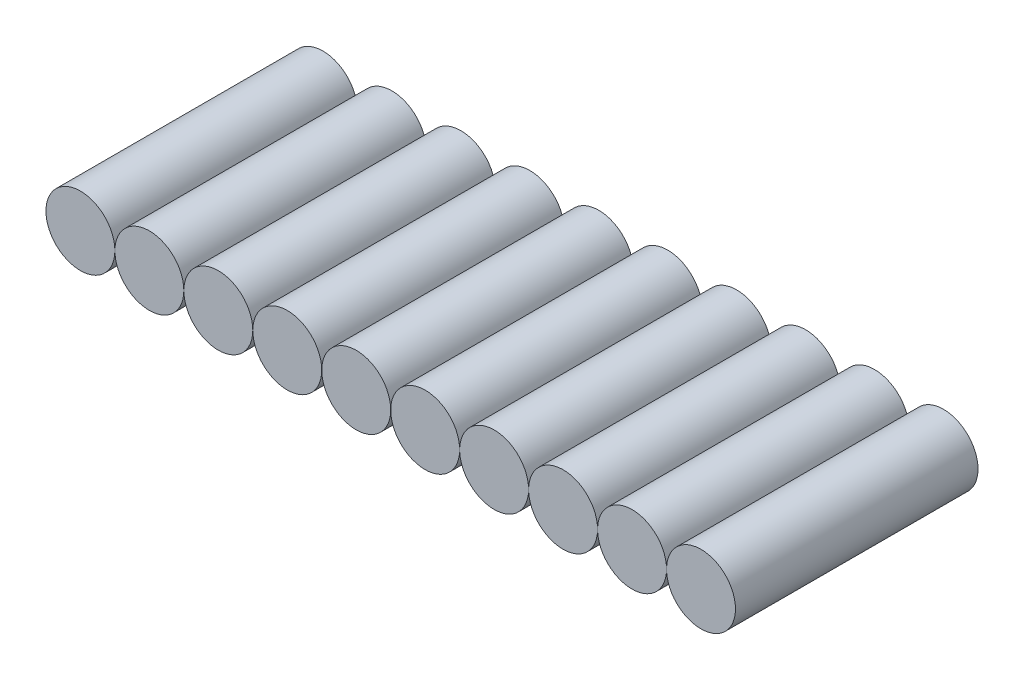
ISO-10303-21;
HEADER;
FILE_DESCRIPTION(('STEP AP214'),'2;1');
FILE_NAME('part.step','',(''),(''),'','','');
FILE_SCHEMA(('AUTOMOTIVE_DESIGN { 1 0 10303 214 1 1 1 1 }'));
ENDSEC;
DATA;
#1=APPLICATION_CONTEXT('core data for automotive mechanical design processes');
#2=APPLICATION_PROTOCOL_DEFINITION('international standard','automotive_design',2000,#1);
#3=PRODUCT_CONTEXT('',#1,'mechanical');
#4=PRODUCT('Part','Part','',(#3));
#5=PRODUCT_RELATED_PRODUCT_CATEGORY('part','',(#4));
#6=PRODUCT_DEFINITION_FORMATION('','',#4);
#7=PRODUCT_DEFINITION_CONTEXT('part definition',#1,'design');
#8=PRODUCT_DEFINITION('design','',#6,#7);
#9=PRODUCT_DEFINITION_SHAPE('','',#8);
#10=(LENGTH_UNIT() NAMED_UNIT(*) SI_UNIT(.MILLI.,.METRE.));
#11=(NAMED_UNIT(*) PLANE_ANGLE_UNIT() SI_UNIT($,.RADIAN.));
#12=(NAMED_UNIT(*) SI_UNIT($,.STERADIAN.) SOLID_ANGLE_UNIT());
#13=UNCERTAINTY_MEASURE_WITH_UNIT(LENGTH_MEASURE(1.E-05),#10,'distance_accuracy_value','');
#14=(GEOMETRIC_REPRESENTATION_CONTEXT(3) GLOBAL_UNCERTAINTY_ASSIGNED_CONTEXT((#13)) GLOBAL_UNIT_ASSIGNED_CONTEXT((#10,
#11,#12)) REPRESENTATION_CONTEXT('',''));
#15=CARTESIAN_POINT('',(0.,0.,0.));
#16=DIRECTION('',(0.,0.,1.));
#17=DIRECTION('',(1.,0.,0.));
#18=AXIS2_PLACEMENT_3D('',#15,#16,#17);
#19=CARTESIAN_POINT('',(130.5,0.,51.));
#20=DIRECTION('',(0.,0.,-1.));
#21=DIRECTION('',(-1.,0.,0.));
#22=AXIS2_PLACEMENT_3D('',#19,#20,#21);
#23=CYLINDRICAL_SURFACE('',#22,7.25);
#24=CARTESIAN_POINT('',(130.5,0.,51.));
#25=DIRECTION('',(0.,0.,1.));
#26=DIRECTION('',(1.,0.,0.));
#27=AXIS2_PLACEMENT_3D('',#24,#25,#26);
#28=CIRCLE('',#27,7.25);
#29=CARTESIAN_POINT('',(137.75,0.,51.));
#30=VERTEX_POINT('',#29);
#31=EDGE_CURVE('E12',#30,#30,#28,.T.);
#32=ORIENTED_EDGE('',*,*,#31,.F.);
#33=EDGE_LOOP('',(#32));
#34=FACE_BOUND('',#33,.T.);
#35=CARTESIAN_POINT('',(130.5,0.,0.));
#36=DIRECTION('',(0.,0.,1.));
#37=DIRECTION('',(1.,0.,0.));
#38=AXIS2_PLACEMENT_3D('',#35,#36,#37);
#39=CIRCLE('',#38,7.25);
#40=CARTESIAN_POINT('',(137.75,0.,0.));
#41=VERTEX_POINT('',#40);
#42=EDGE_CURVE('E99',#41,#41,#39,.T.);
#43=ORIENTED_EDGE('',*,*,#42,.T.);
#44=EDGE_LOOP('',(#43));
#45=FACE_BOUND('',#44,.T.);
#46=ADVANCED_FACE('F96',(#34,#45),#23,.T.);
#47=CARTESIAN_POINT('',(0.,0.,51.));
#48=DIRECTION('',(0.,0.,1.));
#49=DIRECTION('',(1.,0.,0.));
#50=AXIS2_PLACEMENT_3D('',#47,#48,#49);
#51=PLANE('',#50);
#52=ORIENTED_EDGE('',*,*,#31,.T.);
#53=EDGE_LOOP('',(#52));
#54=FACE_BOUND('',#53,.T.);
#55=ADVANCED_FACE('F111',(#54),#51,.T.);
#56=CARTESIAN_POINT('',(0.,0.,0.));
#57=DIRECTION('',(0.,0.,1.));
#58=DIRECTION('',(1.,0.,0.));
#59=AXIS2_PLACEMENT_3D('',#56,#57,#58);
#60=PLANE('',#59);
#61=ORIENTED_EDGE('',*,*,#42,.F.);
#62=EDGE_LOOP('',(#61));
#63=FACE_BOUND('',#62,.T.);
#64=ADVANCED_FACE('F109',(#63),#60,.F.);
#65=CLOSED_SHELL('',(#46,#55,#64));
#66=MANIFOLD_SOLID_BREP('B2',#65);
#67=CARTESIAN_POINT('',(116.,0.,51.));
#68=DIRECTION('',(0.,0.,-1.));
#69=DIRECTION('',(-1.,0.,0.));
#70=AXIS2_PLACEMENT_3D('',#67,#68,#69);
#71=CYLINDRICAL_SURFACE('',#70,7.25);
#72=CARTESIAN_POINT('',(116.,0.,51.));
#73=DIRECTION('',(0.,0.,1.));
#74=DIRECTION('',(1.,0.,0.));
#75=AXIS2_PLACEMENT_3D('',#72,#73,#74);
#76=CIRCLE('',#75,7.25);
#77=CARTESIAN_POINT('',(123.25,0.,51.));
#78=VERTEX_POINT('',#77);
#79=EDGE_CURVE('E95',#78,#78,#76,.T.);
#80=ORIENTED_EDGE('',*,*,#79,.F.);
#81=EDGE_LOOP('',(#80));
#82=FACE_BOUND('',#81,.T.);
#83=CARTESIAN_POINT('',(116.,0.,0.));
#84=DIRECTION('',(0.,0.,1.));
#85=DIRECTION('',(1.,0.,0.));
#86=AXIS2_PLACEMENT_3D('',#83,#84,#85);
#87=CIRCLE('',#86,7.25);
#88=CARTESIAN_POINT('',(123.25,0.,0.));
#89=VERTEX_POINT('',#88);
#90=EDGE_CURVE('E148',#89,#89,#87,.T.);
#91=ORIENTED_EDGE('',*,*,#90,.T.);
#92=EDGE_LOOP('',(#91));
#93=FACE_BOUND('',#92,.T.);
#94=ADVANCED_FACE('F145',(#82,#93),#71,.T.);
#95=CARTESIAN_POINT('',(0.,0.,51.));
#96=DIRECTION('',(0.,0.,1.));
#97=DIRECTION('',(1.,0.,0.));
#98=AXIS2_PLACEMENT_3D('',#95,#96,#97);
#99=PLANE('',#98);
#100=ORIENTED_EDGE('',*,*,#79,.T.);
#101=EDGE_LOOP('',(#100));
#102=FACE_BOUND('',#101,.T.);
#103=ADVANCED_FACE('F160',(#102),#99,.T.);
#104=CARTESIAN_POINT('',(0.,0.,0.));
#105=DIRECTION('',(0.,0.,1.));
#106=DIRECTION('',(1.,0.,0.));
#107=AXIS2_PLACEMENT_3D('',#104,#105,#106);
#108=PLANE('',#107);
#109=ORIENTED_EDGE('',*,*,#90,.F.);
#110=EDGE_LOOP('',(#109));
#111=FACE_BOUND('',#110,.T.);
#112=ADVANCED_FACE('F158',(#111),#108,.F.);
#113=CLOSED_SHELL('',(#94,#103,#112));
#114=MANIFOLD_SOLID_BREP('B7',#113);
#115=CARTESIAN_POINT('',(101.5,0.,51.));
#116=DIRECTION('',(0.,0.,-1.));
#117=DIRECTION('',(-1.,0.,0.));
#118=AXIS2_PLACEMENT_3D('',#115,#116,#117);
#119=CYLINDRICAL_SURFACE('',#118,7.25);
#120=CARTESIAN_POINT('',(101.5,0.,51.));
#121=DIRECTION('',(0.,0.,1.));
#122=DIRECTION('',(1.,0.,0.));
#123=AXIS2_PLACEMENT_3D('',#120,#121,#122);
#124=CIRCLE('',#123,7.25);
#125=CARTESIAN_POINT('',(108.75,0.,51.));
#126=VERTEX_POINT('',#125);
#127=EDGE_CURVE('E144',#126,#126,#124,.T.);
#128=ORIENTED_EDGE('',*,*,#127,.F.);
#129=EDGE_LOOP('',(#128));
#130=FACE_BOUND('',#129,.T.);
#131=CARTESIAN_POINT('',(101.5,0.,0.));
#132=DIRECTION('',(0.,0.,1.));
#133=DIRECTION('',(1.,0.,0.));
#134=AXIS2_PLACEMENT_3D('',#131,#132,#133);
#135=CIRCLE('',#134,7.25);
#136=CARTESIAN_POINT('',(108.75,0.,0.));
#137=VERTEX_POINT('',#136);
#138=EDGE_CURVE('E197',#137,#137,#135,.T.);
#139=ORIENTED_EDGE('',*,*,#138,.T.);
#140=EDGE_LOOP('',(#139));
#141=FACE_BOUND('',#140,.T.);
#142=ADVANCED_FACE('F194',(#130,#141),#119,.T.);
#143=CARTESIAN_POINT('',(0.,0.,51.));
#144=DIRECTION('',(0.,0.,1.));
#145=DIRECTION('',(1.,0.,0.));
#146=AXIS2_PLACEMENT_3D('',#143,#144,#145);
#147=PLANE('',#146);
#148=ORIENTED_EDGE('',*,*,#127,.T.);
#149=EDGE_LOOP('',(#148));
#150=FACE_BOUND('',#149,.T.);
#151=ADVANCED_FACE('F209',(#150),#147,.T.);
#152=CARTESIAN_POINT('',(0.,0.,0.));
#153=DIRECTION('',(0.,0.,1.));
#154=DIRECTION('',(1.,0.,0.));
#155=AXIS2_PLACEMENT_3D('',#152,#153,#154);
#156=PLANE('',#155);
#157=ORIENTED_EDGE('',*,*,#138,.F.);
#158=EDGE_LOOP('',(#157));
#159=FACE_BOUND('',#158,.T.);
#160=ADVANCED_FACE('F207',(#159),#156,.F.);
#161=CLOSED_SHELL('',(#142,#151,#160));
#162=MANIFOLD_SOLID_BREP('B90',#161);
#163=CARTESIAN_POINT('',(87.,0.,51.));
#164=DIRECTION('',(0.,0.,-1.));
#165=DIRECTION('',(-1.,0.,0.));
#166=AXIS2_PLACEMENT_3D('',#163,#164,#165);
#167=CYLINDRICAL_SURFACE('',#166,7.25);
#168=CARTESIAN_POINT('',(87.,0.,51.));
#169=DIRECTION('',(0.,0.,1.));
#170=DIRECTION('',(1.,0.,0.));
#171=AXIS2_PLACEMENT_3D('',#168,#169,#170);
#172=CIRCLE('',#171,7.25);
#173=CARTESIAN_POINT('',(94.25,0.,51.));
#174=VERTEX_POINT('',#173);
#175=EDGE_CURVE('E193',#174,#174,#172,.T.);
#176=ORIENTED_EDGE('',*,*,#175,.F.);
#177=EDGE_LOOP('',(#176));
#178=FACE_BOUND('',#177,.T.);
#179=CARTESIAN_POINT('',(87.,0.,0.));
#180=DIRECTION('',(0.,0.,1.));
#181=DIRECTION('',(1.,0.,0.));
#182=AXIS2_PLACEMENT_3D('',#179,#180,#181);
#183=CIRCLE('',#182,7.25);
#184=CARTESIAN_POINT('',(94.25,0.,0.));
#185=VERTEX_POINT('',#184);
#186=EDGE_CURVE('E246',#185,#185,#183,.T.);
#187=ORIENTED_EDGE('',*,*,#186,.T.);
#188=EDGE_LOOP('',(#187));
#189=FACE_BOUND('',#188,.T.);
#190=ADVANCED_FACE('F243',(#178,#189),#167,.T.);
#191=CARTESIAN_POINT('',(0.,0.,51.));
#192=DIRECTION('',(0.,0.,1.));
#193=DIRECTION('',(1.,0.,0.));
#194=AXIS2_PLACEMENT_3D('',#191,#192,#193);
#195=PLANE('',#194);
#196=ORIENTED_EDGE('',*,*,#175,.T.);
#197=EDGE_LOOP('',(#196));
#198=FACE_BOUND('',#197,.T.);
#199=ADVANCED_FACE('F258',(#198),#195,.T.);
#200=CARTESIAN_POINT('',(0.,0.,0.));
#201=DIRECTION('',(0.,0.,1.));
#202=DIRECTION('',(1.,0.,0.));
#203=AXIS2_PLACEMENT_3D('',#200,#201,#202);
#204=PLANE('',#203);
#205=ORIENTED_EDGE('',*,*,#186,.F.);
#206=EDGE_LOOP('',(#205));
#207=FACE_BOUND('',#206,.T.);
#208=ADVANCED_FACE('F256',(#207),#204,.F.);
#209=CLOSED_SHELL('',(#190,#199,#208));
#210=MANIFOLD_SOLID_BREP('B139',#209);
#211=CARTESIAN_POINT('',(72.5,0.,51.));
#212=DIRECTION('',(0.,0.,-1.));
#213=DIRECTION('',(-1.,0.,0.));
#214=AXIS2_PLACEMENT_3D('',#211,#212,#213);
#215=CYLINDRICAL_SURFACE('',#214,7.25);
#216=CARTESIAN_POINT('',(72.5,0.,51.));
#217=DIRECTION('',(0.,0.,1.));
#218=DIRECTION('',(1.,0.,0.));
#219=AXIS2_PLACEMENT_3D('',#216,#217,#218);
#220=CIRCLE('',#219,7.25);
#221=CARTESIAN_POINT('',(79.75,0.,51.));
#222=VERTEX_POINT('',#221);
#223=EDGE_CURVE('E242',#222,#222,#220,.T.);
#224=ORIENTED_EDGE('',*,*,#223,.F.);
#225=EDGE_LOOP('',(#224));
#226=FACE_BOUND('',#225,.T.);
#227=CARTESIAN_POINT('',(72.5,0.,0.));
#228=DIRECTION('',(0.,0.,1.));
#229=DIRECTION('',(1.,0.,0.));
#230=AXIS2_PLACEMENT_3D('',#227,#228,#229);
#231=CIRCLE('',#230,7.25);
#232=CARTESIAN_POINT('',(79.75,0.,0.));
#233=VERTEX_POINT('',#232);
#234=EDGE_CURVE('E295',#233,#233,#231,.T.);
#235=ORIENTED_EDGE('',*,*,#234,.T.);
#236=EDGE_LOOP('',(#235));
#237=FACE_BOUND('',#236,.T.);
#238=ADVANCED_FACE('F292',(#226,#237),#215,.T.);
#239=CARTESIAN_POINT('',(0.,0.,51.));
#240=DIRECTION('',(0.,0.,1.));
#241=DIRECTION('',(1.,0.,0.));
#242=AXIS2_PLACEMENT_3D('',#239,#240,#241);
#243=PLANE('',#242);
#244=ORIENTED_EDGE('',*,*,#223,.T.);
#245=EDGE_LOOP('',(#244));
#246=FACE_BOUND('',#245,.T.);
#247=ADVANCED_FACE('F307',(#246),#243,.T.);
#248=CARTESIAN_POINT('',(0.,0.,0.));
#249=DIRECTION('',(0.,0.,1.));
#250=DIRECTION('',(1.,0.,0.));
#251=AXIS2_PLACEMENT_3D('',#248,#249,#250);
#252=PLANE('',#251);
#253=ORIENTED_EDGE('',*,*,#234,.F.);
#254=EDGE_LOOP('',(#253));
#255=FACE_BOUND('',#254,.T.);
#256=ADVANCED_FACE('F305',(#255),#252,.F.);
#257=CLOSED_SHELL('',(#238,#247,#256));
#258=MANIFOLD_SOLID_BREP('B188',#257);
#259=CARTESIAN_POINT('',(58.,0.,51.));
#260=DIRECTION('',(0.,0.,-1.));
#261=DIRECTION('',(-1.,0.,0.));
#262=AXIS2_PLACEMENT_3D('',#259,#260,#261);
#263=CYLINDRICAL_SURFACE('',#262,7.25000000000001);
#264=CARTESIAN_POINT('',(58.,0.,51.));
#265=DIRECTION('',(0.,0.,1.));
#266=DIRECTION('',(1.,0.,0.));
#267=AXIS2_PLACEMENT_3D('',#264,#265,#266);
#268=CIRCLE('',#267,7.25000000000001);
#269=CARTESIAN_POINT('',(65.25,0.,51.));
#270=VERTEX_POINT('',#269);
#271=EDGE_CURVE('E291',#270,#270,#268,.T.);
#272=ORIENTED_EDGE('',*,*,#271,.F.);
#273=EDGE_LOOP('',(#272));
#274=FACE_BOUND('',#273,.T.);
#275=CARTESIAN_POINT('',(58.,0.,0.));
#276=DIRECTION('',(0.,0.,1.));
#277=DIRECTION('',(1.,0.,0.));
#278=AXIS2_PLACEMENT_3D('',#275,#276,#277);
#279=CIRCLE('',#278,7.25000000000001);
#280=CARTESIAN_POINT('',(65.25,0.,0.));
#281=VERTEX_POINT('',#280);
#282=EDGE_CURVE('E344',#281,#281,#279,.T.);
#283=ORIENTED_EDGE('',*,*,#282,.T.);
#284=EDGE_LOOP('',(#283));
#285=FACE_BOUND('',#284,.T.);
#286=ADVANCED_FACE('F341',(#274,#285),#263,.T.);
#287=CARTESIAN_POINT('',(0.,0.,51.));
#288=DIRECTION('',(0.,0.,1.));
#289=DIRECTION('',(1.,0.,0.));
#290=AXIS2_PLACEMENT_3D('',#287,#288,#289);
#291=PLANE('',#290);
#292=ORIENTED_EDGE('',*,*,#271,.T.);
#293=EDGE_LOOP('',(#292));
#294=FACE_BOUND('',#293,.T.);
#295=ADVANCED_FACE('F356',(#294),#291,.T.);
#296=CARTESIAN_POINT('',(0.,0.,0.));
#297=DIRECTION('',(0.,0.,1.));
#298=DIRECTION('',(1.,0.,0.));
#299=AXIS2_PLACEMENT_3D('',#296,#297,#298);
#300=PLANE('',#299);
#301=ORIENTED_EDGE('',*,*,#282,.F.);
#302=EDGE_LOOP('',(#301));
#303=FACE_BOUND('',#302,.T.);
#304=ADVANCED_FACE('F354',(#303),#300,.F.);
#305=CLOSED_SHELL('',(#286,#295,#304));
#306=MANIFOLD_SOLID_BREP('B237',#305);
#307=CARTESIAN_POINT('',(0.,0.,51.));
#308=DIRECTION('',(0.,0.,-1.));
#309=DIRECTION('',(-1.,0.,0.));
#310=AXIS2_PLACEMENT_3D('',#307,#308,#309);
#311=CYLINDRICAL_SURFACE('',#310,7.25);
#312=CARTESIAN_POINT('',(0.,0.,51.));
#313=DIRECTION('',(0.,0.,1.));
#314=DIRECTION('',(1.,0.,0.));
#315=AXIS2_PLACEMENT_3D('',#312,#313,#314);
#316=CIRCLE('',#315,7.25);
#317=CARTESIAN_POINT('',(7.25,0.,51.));
#318=VERTEX_POINT('',#317);
#319=EDGE_CURVE('E340',#318,#318,#316,.T.);
#320=ORIENTED_EDGE('',*,*,#319,.F.);
#321=EDGE_LOOP('',(#320));
#322=FACE_BOUND('',#321,.T.);
#323=CARTESIAN_POINT('',(0.,0.,0.));
#324=DIRECTION('',(0.,0.,1.));
#325=DIRECTION('',(1.,0.,0.));
#326=AXIS2_PLACEMENT_3D('',#323,#324,#325);
#327=CIRCLE('',#326,7.25);
#328=CARTESIAN_POINT('',(7.25,0.,0.));
#329=VERTEX_POINT('',#328);
#330=EDGE_CURVE('E393',#329,#329,#327,.T.);
#331=ORIENTED_EDGE('',*,*,#330,.T.);
#332=EDGE_LOOP('',(#331));
#333=FACE_BOUND('',#332,.T.);
#334=ADVANCED_FACE('F390',(#322,#333),#311,.T.);
#335=CARTESIAN_POINT('',(0.,0.,51.));
#336=DIRECTION('',(0.,0.,1.));
#337=DIRECTION('',(1.,0.,0.));
#338=AXIS2_PLACEMENT_3D('',#335,#336,#337);
#339=PLANE('',#338);
#340=ORIENTED_EDGE('',*,*,#319,.T.);
#341=EDGE_LOOP('',(#340));
#342=FACE_BOUND('',#341,.T.);
#343=ADVANCED_FACE('F405',(#342),#339,.T.);
#344=CARTESIAN_POINT('',(0.,0.,0.));
#345=DIRECTION('',(0.,0.,1.));
#346=DIRECTION('',(1.,0.,0.));
#347=AXIS2_PLACEMENT_3D('',#344,#345,#346);
#348=PLANE('',#347);
#349=ORIENTED_EDGE('',*,*,#330,.F.);
#350=EDGE_LOOP('',(#349));
#351=FACE_BOUND('',#350,.T.);
#352=ADVANCED_FACE('F403',(#351),#348,.F.);
#353=CLOSED_SHELL('',(#334,#343,#352));
#354=MANIFOLD_SOLID_BREP('B286',#353);
#355=CARTESIAN_POINT('',(43.5,0.,51.));
#356=DIRECTION('',(0.,0.,-1.));
#357=DIRECTION('',(-1.,0.,0.));
#358=AXIS2_PLACEMENT_3D('',#355,#356,#357);
#359=CYLINDRICAL_SURFACE('',#358,7.25);
#360=CARTESIAN_POINT('',(43.5,0.,51.));
#361=DIRECTION('',(0.,0.,1.));
#362=DIRECTION('',(1.,0.,0.));
#363=AXIS2_PLACEMENT_3D('',#360,#361,#362);
#364=CIRCLE('',#363,7.25);
#365=CARTESIAN_POINT('',(50.75,0.,51.));
#366=VERTEX_POINT('',#365);
#367=EDGE_CURVE('E389',#366,#366,#364,.T.);
#368=ORIENTED_EDGE('',*,*,#367,.F.);
#369=EDGE_LOOP('',(#368));
#370=FACE_BOUND('',#369,.T.);
#371=CARTESIAN_POINT('',(43.5,0.,0.));
#372=DIRECTION('',(0.,0.,1.));
#373=DIRECTION('',(1.,0.,0.));
#374=AXIS2_PLACEMENT_3D('',#371,#372,#373);
#375=CIRCLE('',#374,7.25);
#376=CARTESIAN_POINT('',(50.75,0.,0.));
#377=VERTEX_POINT('',#376);
#378=EDGE_CURVE('E442',#377,#377,#375,.T.);
#379=ORIENTED_EDGE('',*,*,#378,.T.);
#380=EDGE_LOOP('',(#379));
#381=FACE_BOUND('',#380,.T.);
#382=ADVANCED_FACE('F439',(#370,#381),#359,.T.);
#383=CARTESIAN_POINT('',(0.,0.,51.));
#384=DIRECTION('',(0.,0.,1.));
#385=DIRECTION('',(1.,0.,0.));
#386=AXIS2_PLACEMENT_3D('',#383,#384,#385);
#387=PLANE('',#386);
#388=ORIENTED_EDGE('',*,*,#367,.T.);
#389=EDGE_LOOP('',(#388));
#390=FACE_BOUND('',#389,.T.);
#391=ADVANCED_FACE('F454',(#390),#387,.T.);
#392=CARTESIAN_POINT('',(0.,0.,0.));
#393=DIRECTION('',(0.,0.,1.));
#394=DIRECTION('',(1.,0.,0.));
#395=AXIS2_PLACEMENT_3D('',#392,#393,#394);
#396=PLANE('',#395);
#397=ORIENTED_EDGE('',*,*,#378,.F.);
#398=EDGE_LOOP('',(#397));
#399=FACE_BOUND('',#398,.T.);
#400=ADVANCED_FACE('F452',(#399),#396,.F.);
#401=CLOSED_SHELL('',(#382,#391,#400));
#402=MANIFOLD_SOLID_BREP('B335',#401);
#403=CARTESIAN_POINT('',(29.,0.,51.));
#404=DIRECTION('',(0.,0.,-1.));
#405=DIRECTION('',(-1.,0.,0.));
#406=AXIS2_PLACEMENT_3D('',#403,#404,#405);
#407=CYLINDRICAL_SURFACE('',#406,7.25);
#408=CARTESIAN_POINT('',(29.,0.,51.));
#409=DIRECTION('',(0.,0.,1.));
#410=DIRECTION('',(1.,0.,0.));
#411=AXIS2_PLACEMENT_3D('',#408,#409,#410);
#412=CIRCLE('',#411,7.25);
#413=CARTESIAN_POINT('',(36.25,0.,51.));
#414=VERTEX_POINT('',#413);
#415=EDGE_CURVE('E438',#414,#414,#412,.T.);
#416=ORIENTED_EDGE('',*,*,#415,.F.);
#417=EDGE_LOOP('',(#416));
#418=FACE_BOUND('',#417,.T.);
#419=CARTESIAN_POINT('',(29.,0.,0.));
#420=DIRECTION('',(0.,0.,1.));
#421=DIRECTION('',(1.,0.,0.));
#422=AXIS2_PLACEMENT_3D('',#419,#420,#421);
#423=CIRCLE('',#422,7.25);
#424=CARTESIAN_POINT('',(36.25,0.,0.));
#425=VERTEX_POINT('',#424);
#426=EDGE_CURVE('E490',#425,#425,#423,.T.);
#427=ORIENTED_EDGE('',*,*,#426,.T.);
#428=EDGE_LOOP('',(#427));
#429=FACE_BOUND('',#428,.T.);
#430=ADVANCED_FACE('F487',(#418,#429),#407,.T.);
#431=CARTESIAN_POINT('',(0.,0.,51.));
#432=DIRECTION('',(0.,0.,1.));
#433=DIRECTION('',(1.,0.,0.));
#434=AXIS2_PLACEMENT_3D('',#431,#432,#433);
#435=PLANE('',#434);
#436=ORIENTED_EDGE('',*,*,#415,.T.);
#437=EDGE_LOOP('',(#436));
#438=FACE_BOUND('',#437,.T.);
#439=ADVANCED_FACE('F502',(#438),#435,.T.);
#440=CARTESIAN_POINT('',(0.,0.,0.));
#441=DIRECTION('',(0.,0.,1.));
#442=DIRECTION('',(1.,0.,0.));
#443=AXIS2_PLACEMENT_3D('',#440,#441,#442);
#444=PLANE('',#443);
#445=ORIENTED_EDGE('',*,*,#426,.F.);
#446=EDGE_LOOP('',(#445));
#447=FACE_BOUND('',#446,.T.);
#448=ADVANCED_FACE('F500',(#447),#444,.F.);
#449=CLOSED_SHELL('',(#430,#439,#448));
#450=MANIFOLD_SOLID_BREP('B384',#449);
#451=CARTESIAN_POINT('',(14.5,0.,51.));
#452=DIRECTION('',(0.,0.,-1.));
#453=DIRECTION('',(-1.,0.,0.));
#454=AXIS2_PLACEMENT_3D('',#451,#452,#453);
#455=CYLINDRICAL_SURFACE('',#454,7.25);
#456=CARTESIAN_POINT('',(14.5,0.,51.));
#457=DIRECTION('',(0.,0.,1.));
#458=DIRECTION('',(1.,0.,0.));
#459=AXIS2_PLACEMENT_3D('',#456,#457,#458);
#460=CIRCLE('',#459,7.25);
#461=CARTESIAN_POINT('',(21.75,0.,51.));
#462=VERTEX_POINT('',#461);
#463=EDGE_CURVE('E486',#462,#462,#460,.T.);
#464=ORIENTED_EDGE('',*,*,#463,.F.);
#465=EDGE_LOOP('',(#464));
#466=FACE_BOUND('',#465,.T.);
#467=CARTESIAN_POINT('',(14.5,0.,0.));
#468=DIRECTION('',(0.,0.,1.));
#469=DIRECTION('',(1.,0.,0.));
#470=AXIS2_PLACEMENT_3D('',#467,#468,#469);
#471=CIRCLE('',#470,7.25);
#472=CARTESIAN_POINT('',(21.75,0.,0.));
#473=VERTEX_POINT('',#472);
#474=EDGE_CURVE('E531',#473,#473,#471,.T.);
#475=ORIENTED_EDGE('',*,*,#474,.T.);
#476=EDGE_LOOP('',(#475));
#477=FACE_BOUND('',#476,.T.);
#478=ADVANCED_FACE('F528',(#466,#477),#455,.T.);
#479=CARTESIAN_POINT('',(0.,0.,51.));
#480=DIRECTION('',(0.,0.,1.));
#481=DIRECTION('',(1.,0.,0.));
#482=AXIS2_PLACEMENT_3D('',#479,#480,#481);
#483=PLANE('',#482);
#484=ORIENTED_EDGE('',*,*,#463,.T.);
#485=EDGE_LOOP('',(#484));
#486=FACE_BOUND('',#485,.T.);
#487=ADVANCED_FACE('F543',(#486),#483,.T.);
#488=CARTESIAN_POINT('',(0.,0.,0.));
#489=DIRECTION('',(0.,0.,1.));
#490=DIRECTION('',(1.,0.,0.));
#491=AXIS2_PLACEMENT_3D('',#488,#489,#490);
#492=PLANE('',#491);
#493=ORIENTED_EDGE('',*,*,#474,.F.);
#494=EDGE_LOOP('',(#493));
#495=FACE_BOUND('',#494,.T.);
#496=ADVANCED_FACE('F541',(#495),#492,.F.);
#497=CLOSED_SHELL('',(#478,#487,#496));
#498=MANIFOLD_SOLID_BREP('B433',#497);
#499=ADVANCED_BREP_SHAPE_REPRESENTATION('',(#18,#66,#114,#162,#210,#258,#306,#354,#402,#450,
#498),#14);
#500=SHAPE_DEFINITION_REPRESENTATION(#9,#499);
ENDSEC;
END-ISO-10303-21;
